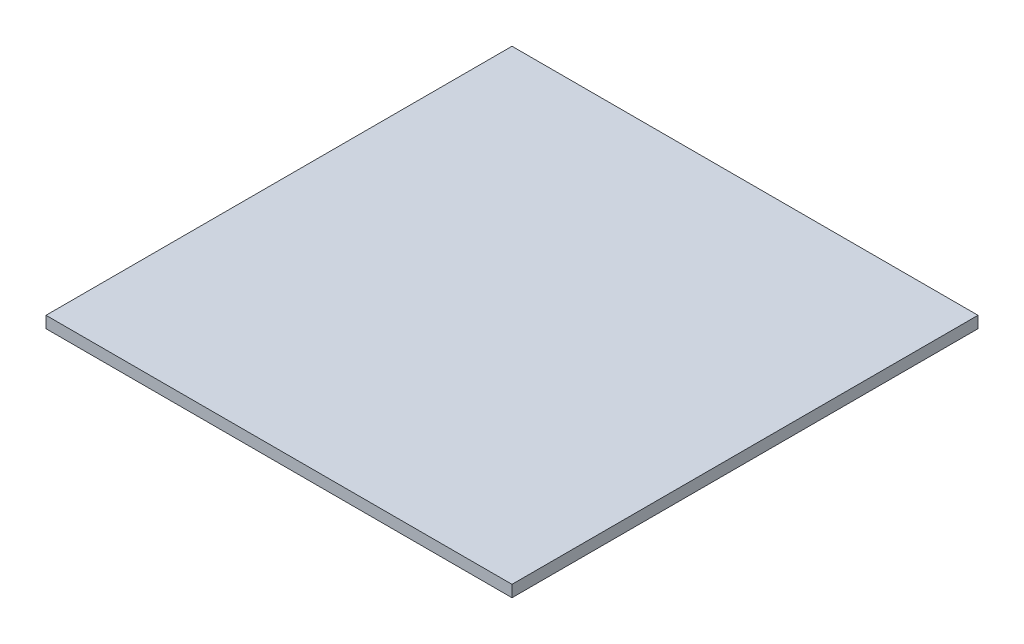
ISO-10303-21;
HEADER;
FILE_DESCRIPTION(('STEP AP214'),'2;1');
FILE_NAME('part.step','',(''),(''),'','','');
FILE_SCHEMA(('AUTOMOTIVE_DESIGN { 1 0 10303 214 1 1 1 1 }'));
ENDSEC;
DATA;
#1=APPLICATION_CONTEXT('core data for automotive mechanical design processes');
#2=APPLICATION_PROTOCOL_DEFINITION('international standard','automotive_design',2000,#1);
#3=PRODUCT_CONTEXT('',#1,'mechanical');
#4=PRODUCT('Part','Part','',(#3));
#5=PRODUCT_RELATED_PRODUCT_CATEGORY('part','',(#4));
#6=PRODUCT_DEFINITION_FORMATION('','',#4);
#7=PRODUCT_DEFINITION_CONTEXT('part definition',#1,'design');
#8=PRODUCT_DEFINITION('design','',#6,#7);
#9=PRODUCT_DEFINITION_SHAPE('','',#8);
#10=(LENGTH_UNIT() NAMED_UNIT(*) SI_UNIT(.MILLI.,.METRE.));
#11=(NAMED_UNIT(*) PLANE_ANGLE_UNIT() SI_UNIT($,.RADIAN.));
#12=(NAMED_UNIT(*) SI_UNIT($,.STERADIAN.) SOLID_ANGLE_UNIT());
#13=UNCERTAINTY_MEASURE_WITH_UNIT(LENGTH_MEASURE(1.E-05),#10,'distance_accuracy_value','');
#14=(GEOMETRIC_REPRESENTATION_CONTEXT(3) GLOBAL_UNCERTAINTY_ASSIGNED_CONTEXT((#13)) GLOBAL_UNIT_ASSIGNED_CONTEXT((#10,
#11,#12)) REPRESENTATION_CONTEXT('',''));
#15=CARTESIAN_POINT('',(0.,0.,0.));
#16=DIRECTION('',(0.,0.,1.));
#17=DIRECTION('',(1.,0.,0.));
#18=AXIS2_PLACEMENT_3D('',#15,#16,#17);
#19=CARTESIAN_POINT('',(300.,15.,300.));
#20=DIRECTION('',(-1.,0.,0.));
#21=DIRECTION('',(0.,0.,1.));
#22=AXIS2_PLACEMENT_3D('',#19,#20,#21);
#23=PLANE('',#22);
#24=DIRECTION('',(0.,0.,-1.));
#25=VECTOR('',#24,1.);
#26=CARTESIAN_POINT('',(300.,0.,300.));
#27=LINE('',#26,#25);
#28=CARTESIAN_POINT('',(300.,0.,300.));
#29=VERTEX_POINT('',#28);
#30=CARTESIAN_POINT('',(300.,0.,-300.));
#31=VERTEX_POINT('',#30);
#32=EDGE_CURVE('E100',#29,#31,#27,.T.);
#33=ORIENTED_EDGE('',*,*,#32,.T.);
#34=DIRECTION('',(0.,-1.,0.));
#35=VECTOR('',#34,1.);
#36=CARTESIAN_POINT('',(300.,15.,-300.));
#37=LINE('',#36,#35);
#38=CARTESIAN_POINT('',(300.,15.,-300.));
#39=VERTEX_POINT('',#38);
#40=EDGE_CURVE('E11',#39,#31,#37,.T.);
#41=ORIENTED_EDGE('',*,*,#40,.F.);
#42=DIRECTION('',(0.,0.,-1.));
#43=VECTOR('',#42,1.);
#44=CARTESIAN_POINT('',(300.,15.,300.));
#45=LINE('',#44,#43);
#46=CARTESIAN_POINT('',(300.,15.,300.));
#47=VERTEX_POINT('',#46);
#48=EDGE_CURVE('E88',#47,#39,#45,.T.);
#49=ORIENTED_EDGE('',*,*,#48,.F.);
#50=DIRECTION('',(0.,-1.,0.));
#51=VECTOR('',#50,1.);
#52=CARTESIAN_POINT('',(300.,15.,300.));
#53=LINE('',#52,#51);
#54=EDGE_CURVE('E96',#47,#29,#53,.T.);
#55=ORIENTED_EDGE('',*,*,#54,.T.);
#56=EDGE_LOOP('',(#33,#41,#49,#55));
#57=FACE_BOUND('',#56,.T.);
#58=ADVANCED_FACE('F37',(#57),#23,.F.);
#59=CARTESIAN_POINT('',(-300.,15.,-300.));
#60=DIRECTION('',(0.,0.,1.));
#61=DIRECTION('',(1.,0.,0.));
#62=AXIS2_PLACEMENT_3D('',#59,#60,#61);
#63=PLANE('',#62);
#64=DIRECTION('',(-1.,0.,0.));
#65=VECTOR('',#64,1.);
#66=CARTESIAN_POINT('',(-300.,0.,-300.));
#67=LINE('',#66,#65);
#68=CARTESIAN_POINT('',(-300.,0.,-300.));
#69=VERTEX_POINT('',#68);
#70=EDGE_CURVE('E92',#31,#69,#67,.T.);
#71=ORIENTED_EDGE('',*,*,#70,.T.);
#72=DIRECTION('',(0.,-1.,0.));
#73=VECTOR('',#72,1.);
#74=CARTESIAN_POINT('',(-300.,15.,-300.));
#75=LINE('',#74,#73);
#76=CARTESIAN_POINT('',(-300.,15.,-300.));
#77=VERTEX_POINT('',#76);
#78=EDGE_CURVE('E45',#77,#69,#75,.T.);
#79=ORIENTED_EDGE('',*,*,#78,.F.);
#80=DIRECTION('',(-1.,0.,0.));
#81=VECTOR('',#80,1.);
#82=CARTESIAN_POINT('',(-300.,15.,-300.));
#83=LINE('',#82,#81);
#84=EDGE_CURVE('E83',#39,#77,#83,.T.);
#85=ORIENTED_EDGE('',*,*,#84,.F.);
#86=ORIENTED_EDGE('',*,*,#40,.T.);
#87=EDGE_LOOP('',(#71,#79,#85,#86));
#88=FACE_BOUND('',#87,.T.);
#89=ADVANCED_FACE('F91',(#88),#63,.F.);
#90=CARTESIAN_POINT('',(-300.,15.,300.));
#91=DIRECTION('',(1.,0.,0.));
#92=DIRECTION('',(0.,0.,-1.));
#93=AXIS2_PLACEMENT_3D('',#90,#91,#92);
#94=PLANE('',#93);
#95=DIRECTION('',(0.,0.,1.));
#96=VECTOR('',#95,1.);
#97=CARTESIAN_POINT('',(-300.,0.,300.));
#98=LINE('',#97,#96);
#99=CARTESIAN_POINT('',(-300.,0.,300.));
#100=VERTEX_POINT('',#99);
#101=EDGE_CURVE('E70',#69,#100,#98,.T.);
#102=ORIENTED_EDGE('',*,*,#101,.T.);
#103=DIRECTION('',(0.,-1.,0.));
#104=VECTOR('',#103,1.);
#105=CARTESIAN_POINT('',(-300.,15.,300.));
#106=LINE('',#105,#104);
#107=CARTESIAN_POINT('',(-300.,15.,300.));
#108=VERTEX_POINT('',#107);
#109=EDGE_CURVE('E93',#108,#100,#106,.T.);
#110=ORIENTED_EDGE('',*,*,#109,.F.);
#111=DIRECTION('',(0.,0.,1.));
#112=VECTOR('',#111,1.);
#113=CARTESIAN_POINT('',(-300.,15.,300.));
#114=LINE('',#113,#112);
#115=EDGE_CURVE('E86',#77,#108,#114,.T.);
#116=ORIENTED_EDGE('',*,*,#115,.F.);
#117=ORIENTED_EDGE('',*,*,#78,.T.);
#118=EDGE_LOOP('',(#102,#110,#116,#117));
#119=FACE_BOUND('',#118,.T.);
#120=ADVANCED_FACE('F94',(#119),#94,.F.);
#121=CARTESIAN_POINT('',(-300.,15.,300.));
#122=DIRECTION('',(0.,0.,-1.));
#123=DIRECTION('',(-1.,0.,0.));
#124=AXIS2_PLACEMENT_3D('',#121,#122,#123);
#125=PLANE('',#124);
#126=DIRECTION('',(1.,0.,0.));
#127=VECTOR('',#126,1.);
#128=CARTESIAN_POINT('',(-300.,0.,300.));
#129=LINE('',#128,#127);
#130=EDGE_CURVE('E76',#100,#29,#129,.T.);
#131=ORIENTED_EDGE('',*,*,#130,.T.);
#132=ORIENTED_EDGE('',*,*,#54,.F.);
#133=DIRECTION('',(1.,0.,0.));
#134=VECTOR('',#133,1.);
#135=CARTESIAN_POINT('',(-300.,15.,300.));
#136=LINE('',#135,#134);
#137=EDGE_CURVE('E53',#108,#47,#136,.T.);
#138=ORIENTED_EDGE('',*,*,#137,.F.);
#139=ORIENTED_EDGE('',*,*,#109,.T.);
#140=EDGE_LOOP('',(#131,#132,#138,#139));
#141=FACE_BOUND('',#140,.T.);
#142=ADVANCED_FACE('F107',(#141),#125,.F.);
#143=CARTESIAN_POINT('',(0.,15.,0.));
#144=DIRECTION('',(0.,-1.,0.));
#145=DIRECTION('',(0.,0.,-1.));
#146=AXIS2_PLACEMENT_3D('',#143,#144,#145);
#147=PLANE('',#146);
#148=ORIENTED_EDGE('',*,*,#48,.T.);
#149=ORIENTED_EDGE('',*,*,#84,.T.);
#150=ORIENTED_EDGE('',*,*,#115,.T.);
#151=ORIENTED_EDGE('',*,*,#137,.T.);
#152=EDGE_LOOP('',(#148,#149,#150,#151));
#153=FACE_BOUND('',#152,.T.);
#154=ADVANCED_FACE('F84',(#153),#147,.F.);
#155=CARTESIAN_POINT('',(0.,0.,0.));
#156=DIRECTION('',(0.,-1.,0.));
#157=DIRECTION('',(0.,0.,-1.));
#158=AXIS2_PLACEMENT_3D('',#155,#156,#157);
#159=PLANE('',#158);
#160=ORIENTED_EDGE('',*,*,#32,.F.);
#161=ORIENTED_EDGE('',*,*,#130,.F.);
#162=ORIENTED_EDGE('',*,*,#101,.F.);
#163=ORIENTED_EDGE('',*,*,#70,.F.);
#164=EDGE_LOOP('',(#160,#161,#162,#163));
#165=FACE_BOUND('',#164,.T.);
#166=ADVANCED_FACE('F110',(#165),#159,.T.);
#167=CLOSED_SHELL('',(#58,#89,#120,#142,#154,#166));
#168=MANIFOLD_SOLID_BREP('B2',#167);
#169=ADVANCED_BREP_SHAPE_REPRESENTATION('',(#18,#168),#14);
#170=SHAPE_DEFINITION_REPRESENTATION(#9,#169);
ENDSEC;
END-ISO-10303-21;
